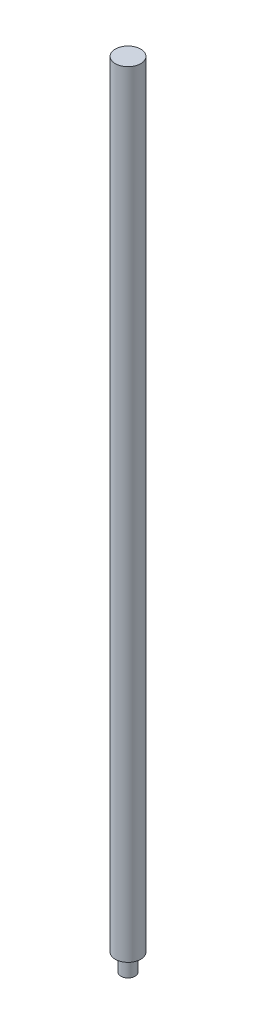
ISO-10303-21;
HEADER;
FILE_DESCRIPTION(('STEP AP214'),'2;1');
FILE_NAME('part.step','',(''),(''),'','','');
FILE_SCHEMA(('AUTOMOTIVE_DESIGN { 1 0 10303 214 1 1 1 1 }'));
ENDSEC;
DATA;
#1=APPLICATION_CONTEXT('core data for automotive mechanical design processes');
#2=APPLICATION_PROTOCOL_DEFINITION('international standard','automotive_design',2000,#1);
#3=PRODUCT_CONTEXT('',#1,'mechanical');
#4=PRODUCT('Part','Part','',(#3));
#5=PRODUCT_RELATED_PRODUCT_CATEGORY('part','',(#4));
#6=PRODUCT_DEFINITION_FORMATION('','',#4);
#7=PRODUCT_DEFINITION_CONTEXT('part definition',#1,'design');
#8=PRODUCT_DEFINITION('design','',#6,#7);
#9=PRODUCT_DEFINITION_SHAPE('','',#8);
#10=(LENGTH_UNIT() NAMED_UNIT(*) SI_UNIT(.MILLI.,.METRE.));
#11=(NAMED_UNIT(*) PLANE_ANGLE_UNIT() SI_UNIT($,.RADIAN.));
#12=(NAMED_UNIT(*) SI_UNIT($,.STERADIAN.) SOLID_ANGLE_UNIT());
#13=UNCERTAINTY_MEASURE_WITH_UNIT(LENGTH_MEASURE(1.E-05),#10,'distance_accuracy_value','');
#14=(GEOMETRIC_REPRESENTATION_CONTEXT(3) GLOBAL_UNCERTAINTY_ASSIGNED_CONTEXT((#13)) GLOBAL_UNIT_ASSIGNED_CONTEXT((#10,
#11,#12)) REPRESENTATION_CONTEXT('',''));
#15=CARTESIAN_POINT('',(0.,0.,0.));
#16=DIRECTION('',(0.,0.,1.));
#17=DIRECTION('',(1.,0.,0.));
#18=AXIS2_PLACEMENT_3D('',#15,#16,#17);
#19=CARTESIAN_POINT('',(0.,500.,0.));
#20=DIRECTION('',(0.,-1.,0.));
#21=DIRECTION('',(0.,0.,-1.));
#22=AXIS2_PLACEMENT_3D('',#19,#20,#21);
#23=CYLINDRICAL_SURFACE('',#22,8.);
#24=CARTESIAN_POINT('',(0.,500.,0.));
#25=DIRECTION('',(0.,1.,0.));
#26=DIRECTION('',(0.,0.,1.));
#27=AXIS2_PLACEMENT_3D('',#24,#25,#26);
#28=CIRCLE('',#27,8.);
#29=CARTESIAN_POINT('',(0.,500.,8.));
#30=VERTEX_POINT('',#29);
#31=EDGE_CURVE('E11',#30,#30,#28,.T.);
#32=ORIENTED_EDGE('',*,*,#31,.F.);
#33=EDGE_LOOP('',(#32));
#34=FACE_BOUND('',#33,.T.);
#35=CARTESIAN_POINT('',(0.,11.,0.));
#36=DIRECTION('',(0.,-1.,0.));
#37=DIRECTION('',(0.,0.,-1.));
#38=AXIS2_PLACEMENT_3D('',#35,#36,#37);
#39=CIRCLE('',#38,8.);
#40=CARTESIAN_POINT('',(0.,11.,-8.));
#41=VERTEX_POINT('',#40);
#42=EDGE_CURVE('E44',#41,#41,#39,.T.);
#43=ORIENTED_EDGE('',*,*,#42,.F.);
#44=EDGE_LOOP('',(#43));
#45=FACE_BOUND('',#44,.T.);
#46=ADVANCED_FACE('F45',(#34,#45),#23,.T.);
#47=CARTESIAN_POINT('',(0.,500.,0.));
#48=DIRECTION('',(0.,1.,0.));
#49=DIRECTION('',(0.,0.,1.));
#50=AXIS2_PLACEMENT_3D('',#47,#48,#49);
#51=PLANE('',#50);
#52=ORIENTED_EDGE('',*,*,#31,.T.);
#53=EDGE_LOOP('',(#52));
#54=FACE_BOUND('',#53,.T.);
#55=ADVANCED_FACE('F68',(#54),#51,.T.);
#56=CARTESIAN_POINT('',(0.,11.,0.));
#57=DIRECTION('',(0.,-1.,0.));
#58=DIRECTION('',(0.,0.,-1.));
#59=AXIS2_PLACEMENT_3D('',#56,#57,#58);
#60=PLANE('',#59);
#61=CARTESIAN_POINT('',(0.,11.,0.));
#62=DIRECTION('',(0.,-1.,0.));
#63=DIRECTION('',(0.,0.,-1.));
#64=AXIS2_PLACEMENT_3D('',#61,#62,#63);
#65=CIRCLE('',#64,4.5);
#66=CARTESIAN_POINT('',(0.,11.,-4.5));
#67=VERTEX_POINT('',#66);
#68=EDGE_CURVE('E55',#67,#67,#65,.T.);
#69=ORIENTED_EDGE('',*,*,#68,.F.);
#70=EDGE_LOOP('',(#69));
#71=FACE_BOUND('',#70,.T.);
#72=ORIENTED_EDGE('',*,*,#42,.T.);
#73=EDGE_LOOP('',(#72));
#74=FACE_BOUND('',#73,.T.);
#75=ADVANCED_FACE('F61',(#71,#74),#60,.T.);
#76=CARTESIAN_POINT('',(0.,11.,0.));
#77=DIRECTION('',(0.,-1.,0.));
#78=DIRECTION('',(0.,0.,-1.));
#79=AXIS2_PLACEMENT_3D('',#76,#77,#78);
#80=CYLINDRICAL_SURFACE('',#79,4.5);
#81=ORIENTED_EDGE('',*,*,#68,.T.);
#82=EDGE_LOOP('',(#81));
#83=FACE_BOUND('',#82,.T.);
#84=CARTESIAN_POINT('',(0.,0.,0.));
#85=DIRECTION('',(0.,-1.,0.));
#86=DIRECTION('',(0.,0.,-1.));
#87=AXIS2_PLACEMENT_3D('',#84,#85,#86);
#88=CIRCLE('',#87,4.5);
#89=CARTESIAN_POINT('',(0.,0.,-4.5));
#90=VERTEX_POINT('',#89);
#91=EDGE_CURVE('E53',#90,#90,#88,.T.);
#92=ORIENTED_EDGE('',*,*,#91,.F.);
#93=EDGE_LOOP('',(#92));
#94=FACE_BOUND('',#93,.T.);
#95=ADVANCED_FACE('F58',(#83,#94),#80,.T.);
#96=CARTESIAN_POINT('',(0.,0.,0.));
#97=DIRECTION('',(0.,1.,0.));
#98=DIRECTION('',(0.,0.,1.));
#99=AXIS2_PLACEMENT_3D('',#96,#97,#98);
#100=PLANE('',#99);
#101=ORIENTED_EDGE('',*,*,#91,.T.);
#102=EDGE_LOOP('',(#101));
#103=FACE_BOUND('',#102,.T.);
#104=ADVANCED_FACE('F79',(#103),#100,.F.);
#105=CLOSED_SHELL('',(#46,#55,#75,#95,#104));
#106=MANIFOLD_SOLID_BREP('B2',#105);
#107=ADVANCED_BREP_SHAPE_REPRESENTATION('',(#18,#106),#14);
#108=SHAPE_DEFINITION_REPRESENTATION(#9,#107);
ENDSEC;
END-ISO-10303-21;
